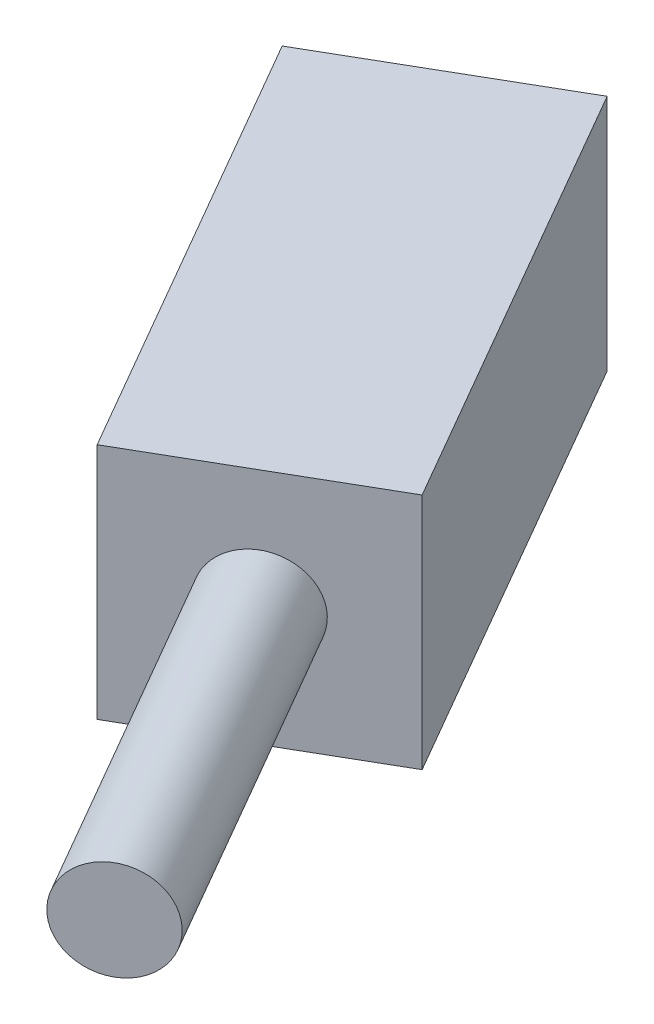
ISO-10303-21;
HEADER;
FILE_DESCRIPTION(('STEP AP214'),'2;1');
FILE_NAME('part.step','',(''),(''),'','','');
FILE_SCHEMA(('AUTOMOTIVE_DESIGN { 1 0 10303 214 1 1 1 1 }'));
ENDSEC;
DATA;
#1=APPLICATION_CONTEXT('core data for automotive mechanical design processes');
#2=APPLICATION_PROTOCOL_DEFINITION('international standard','automotive_design',2000,#1);
#3=PRODUCT_CONTEXT('',#1,'mechanical');
#4=PRODUCT('Part','Part','',(#3));
#5=PRODUCT_RELATED_PRODUCT_CATEGORY('part','',(#4));
#6=PRODUCT_DEFINITION_FORMATION('','',#4);
#7=PRODUCT_DEFINITION_CONTEXT('part definition',#1,'design');
#8=PRODUCT_DEFINITION('design','',#6,#7);
#9=PRODUCT_DEFINITION_SHAPE('','',#8);
#10=(LENGTH_UNIT() NAMED_UNIT(*) SI_UNIT(.MILLI.,.METRE.));
#11=(NAMED_UNIT(*) PLANE_ANGLE_UNIT() SI_UNIT($,.RADIAN.));
#12=(NAMED_UNIT(*) SI_UNIT($,.STERADIAN.) SOLID_ANGLE_UNIT());
#13=UNCERTAINTY_MEASURE_WITH_UNIT(LENGTH_MEASURE(1.E-05),#10,'distance_accuracy_value','');
#14=(GEOMETRIC_REPRESENTATION_CONTEXT(3) GLOBAL_UNCERTAINTY_ASSIGNED_CONTEXT((#13)) GLOBAL_UNIT_ASSIGNED_CONTEXT((#10,
#11,#12)) REPRESENTATION_CONTEXT('',''));
#15=CARTESIAN_POINT('',(0.,0.,0.));
#16=DIRECTION('',(0.,0.,1.));
#17=DIRECTION('',(1.,0.,0.));
#18=AXIS2_PLACEMENT_3D('',#15,#16,#17);
#19=CARTESIAN_POINT('',(211.,-51.,147.87306695894));
#20=DIRECTION('',(0.50000000000019,0.,0.866025403784329));
#21=DIRECTION('',(0.,-1.,0.));
#22=AXIS2_PLACEMENT_3D('',#19,#20,#21);
#23=PLANE('',#22);
#24=CARTESIAN_POINT('',(211.,-51.,147.87306695894));
#25=DIRECTION('',(0.50000000000019,0.,0.866025403784329));
#26=DIRECTION('',(0.,-1.,0.));
#27=AXIS2_PLACEMENT_3D('',#24,#25,#26);
#28=CIRCLE('',#27,2.5);
#29=CARTESIAN_POINT('',(211.,-53.5,147.87306695894));
#30=VERTEX_POINT('',#29);
#31=EDGE_CURVE('E18',#30,#30,#28,.T.);
#32=ORIENTED_EDGE('',*,*,#31,.T.);
#33=EDGE_LOOP('',(#32));
#34=FACE_BOUND('',#33,.T.);
#35=ADVANCED_FACE('F14',(#34),#23,.T.);
#36=CARTESIAN_POINT('',(201.,-51.,130.55255888325));
#37=DIRECTION('',(0.50000000000019,0.,0.866025403784329));
#38=DIRECTION('',(0.,-1.,0.));
#39=AXIS2_PLACEMENT_3D('',#36,#37,#38);
#40=CYLINDRICAL_SURFACE('',#39,2.5);
#41=ORIENTED_EDGE('',*,*,#31,.F.);
#42=DIRECTION('',(0.50000000000019,0.,0.866025403784329));
#43=VECTOR('',#42,1.);
#44=CARTESIAN_POINT('',(201.,-53.5,130.55255888325));
#45=LINE('',#44,#43);
#46=CARTESIAN_POINT('',(201.,-53.5,130.55255888325));
#47=VERTEX_POINT('',#46);
#48=EDGE_CURVE('E9',#47,#30,#45,.T.);
#49=ORIENTED_EDGE('',*,*,#48,.F.);
#50=CARTESIAN_POINT('',(201.,-51.,130.55255888325));
#51=DIRECTION('',(0.50000000000019,0.,0.866025403784329));
#52=DIRECTION('',(0.,-1.,0.));
#53=AXIS2_PLACEMENT_3D('',#50,#51,#52);
#54=CIRCLE('',#53,2.5);
#55=EDGE_CURVE('E114',#47,#47,#54,.T.);
#56=ORIENTED_EDGE('',*,*,#55,.T.);
#57=ORIENTED_EDGE('',*,*,#48,.T.);
#58=EDGE_LOOP('',(#41,#49,#56,#57));
#59=FACE_BOUND('',#58,.T.);
#60=ADVANCED_FACE('F144',(#59),#40,.T.);
#61=CARTESIAN_POINT('',(183.05384757729,-57.,111.46891108675));
#62=DIRECTION('',(0.,-1.,0.));
#63=DIRECTION('',(0.,0.,-1.));
#64=AXIS2_PLACEMENT_3D('',#61,#62,#63);
#65=PLANE('',#64);
#66=DIRECTION('',(0.50000000000019,0.,0.866025403784329));
#67=VECTOR('',#66,1.);
#68=CARTESIAN_POINT('',(183.05384757729,-57.,111.46891108675));
#69=LINE('',#68,#67);
#70=CARTESIAN_POINT('',(183.05384757729,-57.,111.46891108675));
#71=VERTEX_POINT('',#70);
#72=CARTESIAN_POINT('',(195.80384757729,-57.,133.55255888325));
#73=VERTEX_POINT('',#72);
#74=EDGE_CURVE('E84',#71,#73,#69,.T.);
#75=ORIENTED_EDGE('',*,*,#74,.F.);
#76=DIRECTION('',(0.866025403784329,0.,-0.50000000000019));
#77=VECTOR('',#76,1.);
#78=CARTESIAN_POINT('',(183.05384757729,-57.,111.46891108675));
#79=LINE('',#78,#77);
#80=CARTESIAN_POINT('',(193.4461524227,-57.,105.46891108675));
#81=VERTEX_POINT('',#80);
#82=EDGE_CURVE('E44',#71,#81,#79,.T.);
#83=ORIENTED_EDGE('',*,*,#82,.T.);
#84=DIRECTION('',(0.50000000000019,0.,0.866025403784329));
#85=VECTOR('',#84,1.);
#86=CARTESIAN_POINT('',(193.4461524227,-57.,105.46891108675));
#87=LINE('',#86,#85);
#88=CARTESIAN_POINT('',(206.1961524227,-57.,127.55255888325));
#89=VERTEX_POINT('',#88);
#90=EDGE_CURVE('E123',#81,#89,#87,.T.);
#91=ORIENTED_EDGE('',*,*,#90,.T.);
#92=DIRECTION('',(0.866025403784329,0.,-0.50000000000019));
#93=VECTOR('',#92,1.);
#94=CARTESIAN_POINT('',(195.80384757729,-57.,133.55255888325));
#95=LINE('',#94,#93);
#96=EDGE_CURVE('E119',#73,#89,#95,.T.);
#97=ORIENTED_EDGE('',*,*,#96,.F.);
#98=EDGE_LOOP('',(#75,#83,#91,#97));
#99=FACE_BOUND('',#98,.T.);
#100=ADVANCED_FACE('F163',(#99),#65,.T.);
#101=CARTESIAN_POINT('',(183.05384757729,-45.,111.46891108675));
#102=DIRECTION('',(0.50000000000019,0.,0.866025403784329));
#103=DIRECTION('',(0.,-1.,0.));
#104=AXIS2_PLACEMENT_3D('',#101,#102,#103);
#105=PLANE('',#104);
#106=DIRECTION('',(0.,-1.,0.));
#107=VECTOR('',#106,1.);
#108=CARTESIAN_POINT('',(193.4461524227,-45.,105.46891108675));
#109=LINE('',#108,#107);
#110=CARTESIAN_POINT('',(193.4461524227,-45.,105.46891108675));
#111=VERTEX_POINT('',#110);
#112=EDGE_CURVE('E116',#111,#81,#109,.T.);
#113=ORIENTED_EDGE('',*,*,#112,.T.);
#114=ORIENTED_EDGE('',*,*,#82,.F.);
#115=DIRECTION('',(0.,-1.,0.));
#116=VECTOR('',#115,1.);
#117=CARTESIAN_POINT('',(183.05384757729,-45.,111.46891108675));
#118=LINE('',#117,#116);
#119=CARTESIAN_POINT('',(183.05384757729,-45.,111.46891108675));
#120=VERTEX_POINT('',#119);
#121=EDGE_CURVE('E89',#120,#71,#118,.T.);
#122=ORIENTED_EDGE('',*,*,#121,.F.);
#123=DIRECTION('',(0.866025403784329,0.,-0.50000000000019));
#124=VECTOR('',#123,1.);
#125=CARTESIAN_POINT('',(183.05384757729,-45.,111.46891108675));
#126=LINE('',#125,#124);
#127=EDGE_CURVE('E97',#120,#111,#126,.T.);
#128=ORIENTED_EDGE('',*,*,#127,.T.);
#129=EDGE_LOOP('',(#113,#114,#122,#128));
#130=FACE_BOUND('',#129,.T.);
#131=ADVANCED_FACE('F155',(#130),#105,.F.);
#132=CARTESIAN_POINT('',(193.4461524227,-45.,105.46891108675));
#133=DIRECTION('',(0.866025403784329,0.,-0.50000000000019));
#134=DIRECTION('',(0.,-1.,0.));
#135=AXIS2_PLACEMENT_3D('',#132,#133,#134);
#136=PLANE('',#135);
#137=ORIENTED_EDGE('',*,*,#112,.F.);
#138=DIRECTION('',(0.50000000000019,0.,0.866025403784329));
#139=VECTOR('',#138,1.);
#140=CARTESIAN_POINT('',(193.4461524227,-45.,105.46891108675));
#141=LINE('',#140,#139);
#142=CARTESIAN_POINT('',(206.1961524227,-45.,127.55255888325));
#143=VERTEX_POINT('',#142);
#144=EDGE_CURVE('E105',#111,#143,#141,.T.);
#145=ORIENTED_EDGE('',*,*,#144,.T.);
#146=DIRECTION('',(0.,-1.,0.));
#147=VECTOR('',#146,1.);
#148=CARTESIAN_POINT('',(206.1961524227,-45.,127.55255888325));
#149=LINE('',#148,#147);
#150=EDGE_CURVE('E102',#143,#89,#149,.T.);
#151=ORIENTED_EDGE('',*,*,#150,.T.);
#152=ORIENTED_EDGE('',*,*,#90,.F.);
#153=EDGE_LOOP('',(#137,#145,#151,#152));
#154=FACE_BOUND('',#153,.T.);
#155=ADVANCED_FACE('F148',(#154),#136,.T.);
#156=CARTESIAN_POINT('',(195.80384757729,-45.,133.55255888325));
#157=DIRECTION('',(0.50000000000019,0.,0.866025403784329));
#158=DIRECTION('',(0.,-1.,0.));
#159=AXIS2_PLACEMENT_3D('',#156,#157,#158);
#160=PLANE('',#159);
#161=ORIENTED_EDGE('',*,*,#55,.F.);
#162=EDGE_LOOP('',(#161));
#163=FACE_BOUND('',#162,.T.);
#164=DIRECTION('',(0.866025403784329,0.,-0.50000000000019));
#165=VECTOR('',#164,1.);
#166=CARTESIAN_POINT('',(195.80384757729,-45.,133.55255888325));
#167=LINE('',#166,#165);
#168=CARTESIAN_POINT('',(195.80384757729,-45.,133.55255888325));
#169=VERTEX_POINT('',#168);
#170=EDGE_CURVE('E95',#169,#143,#167,.T.);
#171=ORIENTED_EDGE('',*,*,#170,.F.);
#172=DIRECTION('',(0.,-1.,0.));
#173=VECTOR('',#172,1.);
#174=CARTESIAN_POINT('',(195.80384757729,-45.,133.55255888325));
#175=LINE('',#174,#173);
#176=EDGE_CURVE('E79',#169,#73,#175,.T.);
#177=ORIENTED_EDGE('',*,*,#176,.T.);
#178=ORIENTED_EDGE('',*,*,#96,.T.);
#179=ORIENTED_EDGE('',*,*,#150,.F.);
#180=EDGE_LOOP('',(#171,#177,#178,#179));
#181=FACE_BOUND('',#180,.T.);
#182=ADVANCED_FACE('F100',(#163,#181),#160,.T.);
#183=CARTESIAN_POINT('',(183.05384757729,-45.,111.46891108675));
#184=DIRECTION('',(0.866025403784329,0.,-0.50000000000019));
#185=DIRECTION('',(0.,-1.,0.));
#186=AXIS2_PLACEMENT_3D('',#183,#184,#185);
#187=PLANE('',#186);
#188=ORIENTED_EDGE('',*,*,#74,.T.);
#189=ORIENTED_EDGE('',*,*,#176,.F.);
#190=DIRECTION('',(0.50000000000019,0.,0.866025403784329));
#191=VECTOR('',#190,1.);
#192=CARTESIAN_POINT('',(183.05384757729,-45.,111.46891108675));
#193=LINE('',#192,#191);
#194=EDGE_CURVE('E82',#120,#169,#193,.T.);
#195=ORIENTED_EDGE('',*,*,#194,.F.);
#196=ORIENTED_EDGE('',*,*,#121,.T.);
#197=EDGE_LOOP('',(#188,#189,#195,#196));
#198=FACE_BOUND('',#197,.T.);
#199=ADVANCED_FACE('F16',(#198),#187,.F.);
#200=CARTESIAN_POINT('',(183.05384757729,-45.,111.46891108675));
#201=DIRECTION('',(0.,-1.,0.));
#202=DIRECTION('',(0.,0.,-1.));
#203=AXIS2_PLACEMENT_3D('',#200,#201,#202);
#204=PLANE('',#203);
#205=ORIENTED_EDGE('',*,*,#170,.T.);
#206=ORIENTED_EDGE('',*,*,#144,.F.);
#207=ORIENTED_EDGE('',*,*,#127,.F.);
#208=ORIENTED_EDGE('',*,*,#194,.T.);
#209=EDGE_LOOP('',(#205,#206,#207,#208));
#210=FACE_BOUND('',#209,.T.);
#211=ADVANCED_FACE('F93',(#210),#204,.F.);
#212=CLOSED_SHELL('',(#35,#60,#100,#131,#155,#182,#199,#211));
#213=MANIFOLD_SOLID_BREP('B1',#212);
#214=ADVANCED_BREP_SHAPE_REPRESENTATION('',(#18,#213),#14);
#215=SHAPE_DEFINITION_REPRESENTATION(#9,#214);
ENDSEC;
END-ISO-10303-21;
